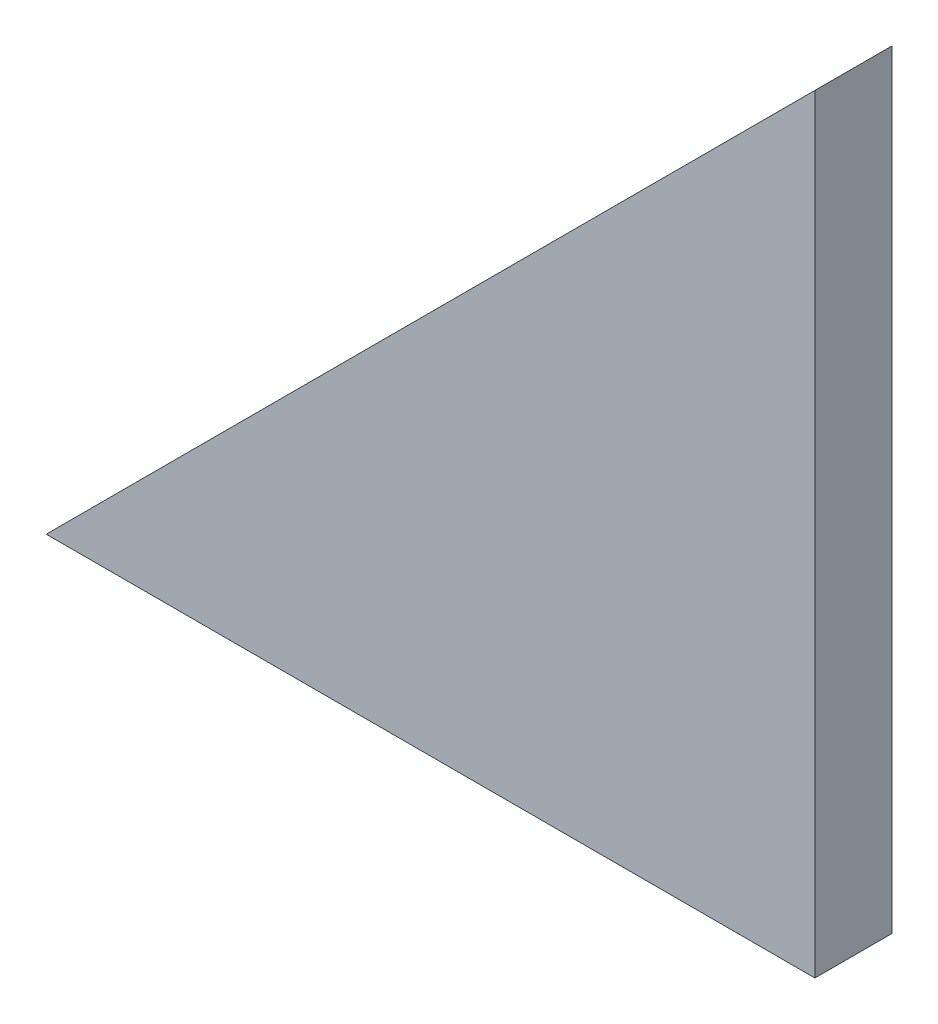
ISO-10303-21;
HEADER;
FILE_DESCRIPTION(('STEP AP214'),'2;1');
FILE_NAME('part.step','',(''),(''),'','','');
FILE_SCHEMA(('AUTOMOTIVE_DESIGN { 1 0 10303 214 1 1 1 1 }'));
ENDSEC;
DATA;
#1=APPLICATION_CONTEXT('core data for automotive mechanical design processes');
#2=APPLICATION_PROTOCOL_DEFINITION('international standard','automotive_design',2000,#1);
#3=PRODUCT_CONTEXT('',#1,'mechanical');
#4=PRODUCT('Part','Part','',(#3));
#5=PRODUCT_RELATED_PRODUCT_CATEGORY('part','',(#4));
#6=PRODUCT_DEFINITION_FORMATION('','',#4);
#7=PRODUCT_DEFINITION_CONTEXT('part definition',#1,'design');
#8=PRODUCT_DEFINITION('design','',#6,#7);
#9=PRODUCT_DEFINITION_SHAPE('','',#8);
#10=(LENGTH_UNIT() NAMED_UNIT(*) SI_UNIT(.MILLI.,.METRE.));
#11=(NAMED_UNIT(*) PLANE_ANGLE_UNIT() SI_UNIT($,.RADIAN.));
#12=(NAMED_UNIT(*) SI_UNIT($,.STERADIAN.) SOLID_ANGLE_UNIT());
#13=UNCERTAINTY_MEASURE_WITH_UNIT(LENGTH_MEASURE(1.E-05),#10,'distance_accuracy_value','');
#14=(GEOMETRIC_REPRESENTATION_CONTEXT(3) GLOBAL_UNCERTAINTY_ASSIGNED_CONTEXT((#13)) GLOBAL_UNIT_ASSIGNED_CONTEXT((#10,
#11,#12)) REPRESENTATION_CONTEXT('',''));
#15=CARTESIAN_POINT('',(0.,0.,0.));
#16=DIRECTION('',(0.,0.,1.));
#17=DIRECTION('',(1.,0.,0.));
#18=AXIS2_PLACEMENT_3D('',#15,#16,#17);
#19=CARTESIAN_POINT('',(-26.2938380459313,12.0815056418426,5.));
#20=DIRECTION('',(0.707106781186548,-0.707106781186547,0.));
#21=DIRECTION('',(0.707106781186547,0.707106781186548,0.));
#22=AXIS2_PLACEMENT_3D('',#19,#20,#21);
#23=PLANE('',#22);
#24=DIRECTION('',(-0.707106781186547,-0.707106781186548,0.));
#25=VECTOR('',#24,1.);
#26=CARTESIAN_POINT('',(-26.2938380459313,12.0815056418426,0.));
#27=LINE('',#26,#25);
#28=CARTESIAN_POINT('',(-26.2938380459313,12.0815056418426,0.));
#29=VERTEX_POINT('',#28);
#30=CARTESIAN_POINT('',(-76.2938380459313,-37.9184943581574,0.));
#31=VERTEX_POINT('',#30);
#32=EDGE_CURVE('E82',#29,#31,#27,.T.);
#33=ORIENTED_EDGE('',*,*,#32,.T.);
#34=DIRECTION('',(0.,0.,-1.));
#35=VECTOR('',#34,1.);
#36=CARTESIAN_POINT('',(-76.2938380459313,-37.9184943581574,5.));
#37=LINE('',#36,#35);
#38=CARTESIAN_POINT('',(-76.2938380459313,-37.9184943581574,5.));
#39=VERTEX_POINT('',#38);
#40=EDGE_CURVE('E11',#39,#31,#37,.T.);
#41=ORIENTED_EDGE('',*,*,#40,.F.);
#42=DIRECTION('',(-0.707106781186547,-0.707106781186548,0.));
#43=VECTOR('',#42,1.);
#44=CARTESIAN_POINT('',(-26.2938380459313,12.0815056418426,5.));
#45=LINE('',#44,#43);
#46=CARTESIAN_POINT('',(-26.2938380459313,12.0815056418426,5.));
#47=VERTEX_POINT('',#46);
#48=EDGE_CURVE('E75',#47,#39,#45,.T.);
#49=ORIENTED_EDGE('',*,*,#48,.F.);
#50=DIRECTION('',(0.,0.,-1.));
#51=VECTOR('',#50,1.);
#52=CARTESIAN_POINT('',(-26.2938380459313,12.0815056418426,5.));
#53=LINE('',#52,#51);
#54=EDGE_CURVE('E83',#47,#29,#53,.T.);
#55=ORIENTED_EDGE('',*,*,#54,.T.);
#56=EDGE_LOOP('',(#33,#41,#49,#55));
#57=FACE_BOUND('',#56,.T.);
#58=ADVANCED_FACE('F35',(#57),#23,.F.);
#59=CARTESIAN_POINT('',(-76.2938380459313,-37.9184943581574,5.));
#60=DIRECTION('',(0.,1.,0.));
#61=DIRECTION('',(0.,0.,1.));
#62=AXIS2_PLACEMENT_3D('',#59,#60,#61);
#63=PLANE('',#62);
#64=DIRECTION('',(1.,0.,0.));
#65=VECTOR('',#64,1.);
#66=CARTESIAN_POINT('',(-76.2938380459313,-37.9184943581574,0.));
#67=LINE('',#66,#65);
#68=CARTESIAN_POINT('',(-26.2938380459313,-37.9184943581574,0.));
#69=VERTEX_POINT('',#68);
#70=EDGE_CURVE('E63',#31,#69,#67,.T.);
#71=ORIENTED_EDGE('',*,*,#70,.T.);
#72=DIRECTION('',(0.,0.,-1.));
#73=VECTOR('',#72,1.);
#74=CARTESIAN_POINT('',(-26.2938380459313,-37.9184943581574,5.));
#75=LINE('',#74,#73);
#76=CARTESIAN_POINT('',(-26.2938380459313,-37.9184943581574,5.));
#77=VERTEX_POINT('',#76);
#78=EDGE_CURVE('E43',#77,#69,#75,.T.);
#79=ORIENTED_EDGE('',*,*,#78,.F.);
#80=DIRECTION('',(1.,0.,0.));
#81=VECTOR('',#80,1.);
#82=CARTESIAN_POINT('',(-76.2938380459313,-37.9184943581574,5.));
#83=LINE('',#82,#81);
#84=EDGE_CURVE('E71',#39,#77,#83,.T.);
#85=ORIENTED_EDGE('',*,*,#84,.F.);
#86=ORIENTED_EDGE('',*,*,#40,.T.);
#87=EDGE_LOOP('',(#71,#79,#85,#86));
#88=FACE_BOUND('',#87,.T.);
#89=ADVANCED_FACE('F72',(#88),#63,.F.);
#90=CARTESIAN_POINT('',(-26.2938380459313,-37.9184943581574,5.));
#91=DIRECTION('',(-1.,0.,0.));
#92=DIRECTION('',(0.,0.,1.));
#93=AXIS2_PLACEMENT_3D('',#90,#91,#92);
#94=PLANE('',#93);
#95=DIRECTION('',(0.,1.,0.));
#96=VECTOR('',#95,1.);
#97=CARTESIAN_POINT('',(-26.2938380459313,-37.9184943581574,0.));
#98=LINE('',#97,#96);
#99=EDGE_CURVE('E68',#69,#29,#98,.T.);
#100=ORIENTED_EDGE('',*,*,#99,.T.);
#101=ORIENTED_EDGE('',*,*,#54,.F.);
#102=DIRECTION('',(0.,1.,0.));
#103=VECTOR('',#102,1.);
#104=CARTESIAN_POINT('',(-26.2938380459313,-37.9184943581574,5.));
#105=LINE('',#104,#103);
#106=EDGE_CURVE('E51',#77,#47,#105,.T.);
#107=ORIENTED_EDGE('',*,*,#106,.F.);
#108=ORIENTED_EDGE('',*,*,#78,.T.);
#109=EDGE_LOOP('',(#100,#101,#107,#108));
#110=FACE_BOUND('',#109,.T.);
#111=ADVANCED_FACE('F90',(#110),#94,.F.);
#112=CARTESIAN_POINT('',(0.,0.,5.));
#113=DIRECTION('',(0.,0.,1.));
#114=DIRECTION('',(1.,0.,0.));
#115=AXIS2_PLACEMENT_3D('',#112,#113,#114);
#116=PLANE('',#115);
#117=ORIENTED_EDGE('',*,*,#48,.T.);
#118=ORIENTED_EDGE('',*,*,#84,.T.);
#119=ORIENTED_EDGE('',*,*,#106,.T.);
#120=EDGE_LOOP('',(#117,#118,#119));
#121=FACE_BOUND('',#120,.T.);
#122=ADVANCED_FACE('F78',(#121),#116,.T.);
#123=CARTESIAN_POINT('',(0.,0.,0.));
#124=DIRECTION('',(0.,0.,1.));
#125=DIRECTION('',(1.,0.,0.));
#126=AXIS2_PLACEMENT_3D('',#123,#124,#125);
#127=PLANE('',#126);
#128=ORIENTED_EDGE('',*,*,#32,.F.);
#129=ORIENTED_EDGE('',*,*,#99,.F.);
#130=ORIENTED_EDGE('',*,*,#70,.F.);
#131=EDGE_LOOP('',(#128,#129,#130));
#132=FACE_BOUND('',#131,.T.);
#133=ADVANCED_FACE('F91',(#132),#127,.F.);
#134=CLOSED_SHELL('',(#58,#89,#111,#122,#133));
#135=MANIFOLD_SOLID_BREP('B2',#134);
#136=ADVANCED_BREP_SHAPE_REPRESENTATION('',(#18,#135),#14);
#137=SHAPE_DEFINITION_REPRESENTATION(#9,#136);
ENDSEC;
END-ISO-10303-21;
